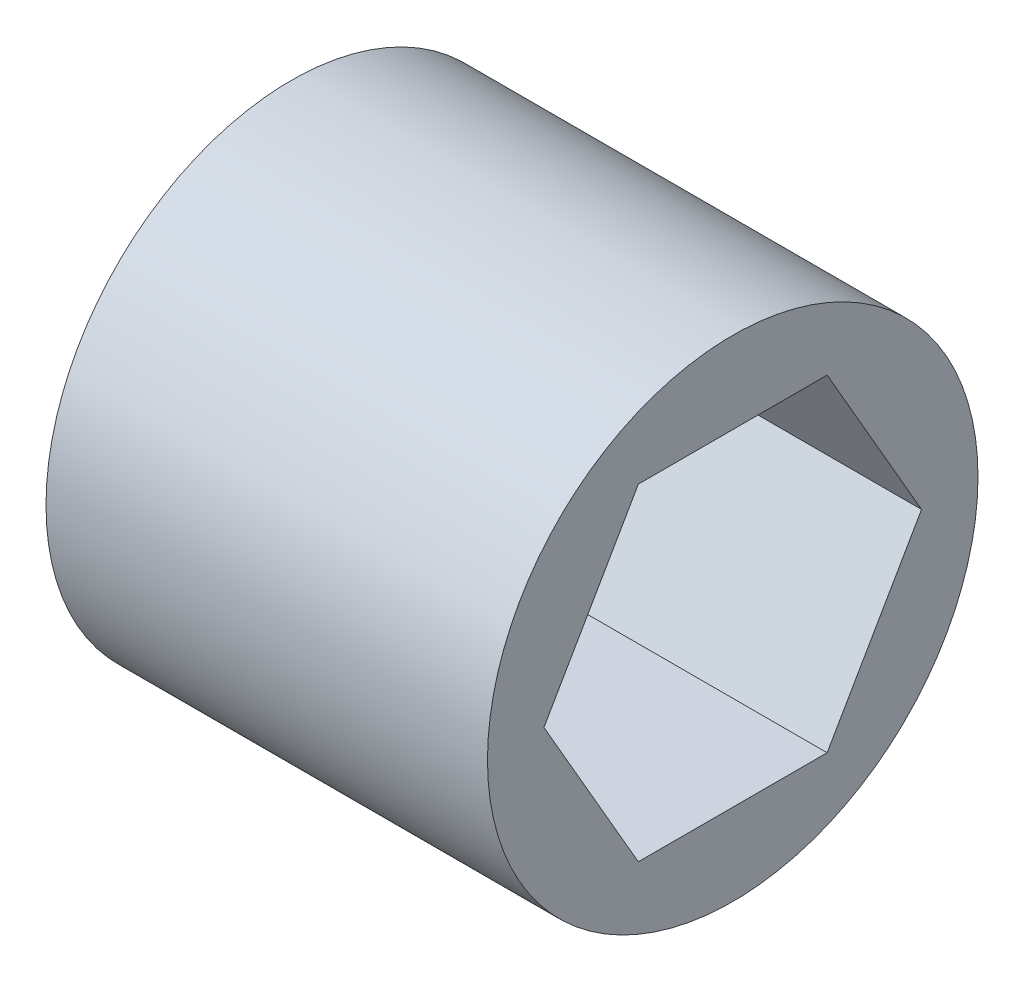
ISO-10303-21;
HEADER;
FILE_DESCRIPTION(('STEP AP214'),'2;1');
FILE_NAME('part.step','',(''),(''),'','','');
FILE_SCHEMA(('AUTOMOTIVE_DESIGN { 1 0 10303 214 1 1 1 1 }'));
ENDSEC;
DATA;
#1=APPLICATION_CONTEXT('core data for automotive mechanical design processes');
#2=APPLICATION_PROTOCOL_DEFINITION('international standard','automotive_design',2000,#1);
#3=PRODUCT_CONTEXT('',#1,'mechanical');
#4=PRODUCT('Part','Part','',(#3));
#5=PRODUCT_RELATED_PRODUCT_CATEGORY('part','',(#4));
#6=PRODUCT_DEFINITION_FORMATION('','',#4);
#7=PRODUCT_DEFINITION_CONTEXT('part definition',#1,'design');
#8=PRODUCT_DEFINITION('design','',#6,#7);
#9=PRODUCT_DEFINITION_SHAPE('','',#8);
#10=(LENGTH_UNIT() NAMED_UNIT(*) SI_UNIT(.MILLI.,.METRE.));
#11=(NAMED_UNIT(*) PLANE_ANGLE_UNIT() SI_UNIT($,.RADIAN.));
#12=(NAMED_UNIT(*) SI_UNIT($,.STERADIAN.) SOLID_ANGLE_UNIT());
#13=UNCERTAINTY_MEASURE_WITH_UNIT(LENGTH_MEASURE(1.E-05),#10,'distance_accuracy_value','');
#14=(GEOMETRIC_REPRESENTATION_CONTEXT(3) GLOBAL_UNCERTAINTY_ASSIGNED_CONTEXT((#13)) GLOBAL_UNIT_ASSIGNED_CONTEXT((#10,
#11,#12)) REPRESENTATION_CONTEXT('',''));
#15=CARTESIAN_POINT('',(0.,0.,0.));
#16=DIRECTION('',(0.,0.,1.));
#17=DIRECTION('',(1.,0.,0.));
#18=AXIS2_PLACEMENT_3D('',#15,#16,#17);
#19=CARTESIAN_POINT('',(17.145,0.,0.));
#20=DIRECTION('',(1.,0.,0.));
#21=DIRECTION('',(0.,0.,-1.));
#22=AXIS2_PLACEMENT_3D('',#19,#20,#21);
#23=PLANE('',#22);
#24=CARTESIAN_POINT('',(17.145,0.,0.));
#25=DIRECTION('',(1.,0.,0.));
#26=DIRECTION('',(0.,0.,-1.));
#27=AXIS2_PLACEMENT_3D('',#24,#25,#26);
#28=CIRCLE('',#27,9.525);
#29=CARTESIAN_POINT('',(17.145,0.,-9.525));
#30=VERTEX_POINT('',#29);
#31=EDGE_CURVE('E11',#30,#30,#28,.T.);
#32=ORIENTED_EDGE('',*,*,#31,.T.);
#33=EDGE_LOOP('',(#32));
#34=FACE_BOUND('',#33,.T.);
#35=DIRECTION('',(0.,0.866025403784438,0.5));
#36=VECTOR('',#35,1.);
#37=CARTESIAN_POINT('',(17.145,0.,-7.33234841870825));
#38=LINE('',#37,#36);
#39=CARTESIAN_POINT('',(17.145,0.,-7.33234841870825));
#40=VERTEX_POINT('',#39);
#41=CARTESIAN_POINT('',(17.145,6.35,-3.66617420935412));
#42=VERTEX_POINT('',#41);
#43=EDGE_CURVE('E100',#40,#42,#38,.T.);
#44=ORIENTED_EDGE('',*,*,#43,.F.);
#45=DIRECTION('',(0.,0.866025403784439,-0.5));
#46=VECTOR('',#45,1.);
#47=CARTESIAN_POINT('',(17.145,-6.35,-3.66617420935412));
#48=LINE('',#47,#46);
#49=CARTESIAN_POINT('',(17.145,-6.35,-3.66617420935412));
#50=VERTEX_POINT('',#49);
#51=EDGE_CURVE('E92',#50,#40,#48,.T.);
#52=ORIENTED_EDGE('',*,*,#51,.F.);
#53=DIRECTION('',(0.,0.,-1.));
#54=VECTOR('',#53,1.);
#55=CARTESIAN_POINT('',(17.145,-6.35,3.66617420935412));
#56=LINE('',#55,#54);
#57=CARTESIAN_POINT('',(17.145,-6.35,3.66617420935412));
#58=VERTEX_POINT('',#57);
#59=EDGE_CURVE('E120',#58,#50,#56,.T.);
#60=ORIENTED_EDGE('',*,*,#59,.F.);
#61=DIRECTION('',(0.,-0.866025403784438,-0.5));
#62=VECTOR('',#61,1.);
#63=CARTESIAN_POINT('',(17.145,0.,7.33234841870825));
#64=LINE('',#63,#62);
#65=CARTESIAN_POINT('',(17.145,0.,7.33234841870825));
#66=VERTEX_POINT('',#65);
#67=EDGE_CURVE('E118',#66,#58,#64,.T.);
#68=ORIENTED_EDGE('',*,*,#67,.F.);
#69=DIRECTION('',(0.,-0.866025403784439,0.5));
#70=VECTOR('',#69,1.);
#71=CARTESIAN_POINT('',(17.145,6.35,3.66617420935412));
#72=LINE('',#71,#70);
#73=CARTESIAN_POINT('',(17.145,6.35,3.66617420935412));
#74=VERTEX_POINT('',#73);
#75=EDGE_CURVE('E114',#74,#66,#72,.T.);
#76=ORIENTED_EDGE('',*,*,#75,.F.);
#77=DIRECTION('',(0.,0.,1.));
#78=VECTOR('',#77,1.);
#79=CARTESIAN_POINT('',(17.145,6.35,-3.66617420935412));
#80=LINE('',#79,#78);
#81=EDGE_CURVE('E112',#42,#74,#80,.T.);
#82=ORIENTED_EDGE('',*,*,#81,.F.);
#83=EDGE_LOOP('',(#44,#52,#60,#68,#76,#82));
#84=FACE_BOUND('',#83,.T.);
#85=ADVANCED_FACE('F39',(#34,#84),#23,.T.);
#86=CARTESIAN_POINT('',(0.,0.,0.));
#87=DIRECTION('',(1.,0.,0.));
#88=DIRECTION('',(0.,0.,-1.));
#89=AXIS2_PLACEMENT_3D('',#86,#87,#88);
#90=PLANE('',#89);
#91=CARTESIAN_POINT('',(0.,0.,0.));
#92=DIRECTION('',(1.,0.,0.));
#93=DIRECTION('',(0.,0.,-1.));
#94=AXIS2_PLACEMENT_3D('',#91,#92,#93);
#95=CIRCLE('',#94,9.525);
#96=CARTESIAN_POINT('',(0.,0.,-9.525));
#97=VERTEX_POINT('',#96);
#98=EDGE_CURVE('E43',#97,#97,#95,.T.);
#99=ORIENTED_EDGE('',*,*,#98,.F.);
#100=EDGE_LOOP('',(#99));
#101=FACE_BOUND('',#100,.T.);
#102=DIRECTION('',(0.,0.866025403784439,-0.5));
#103=VECTOR('',#102,1.);
#104=CARTESIAN_POINT('',(0.,-6.35,-3.66617420935412));
#105=LINE('',#104,#103);
#106=CARTESIAN_POINT('',(0.,-6.35,-3.66617420935412));
#107=VERTEX_POINT('',#106);
#108=CARTESIAN_POINT('',(0.,0.,-7.33234841870825));
#109=VERTEX_POINT('',#108);
#110=EDGE_CURVE('E62',#107,#109,#105,.T.);
#111=ORIENTED_EDGE('',*,*,#110,.T.);
#112=DIRECTION('',(0.,0.866025403784438,0.5));
#113=VECTOR('',#112,1.);
#114=CARTESIAN_POINT('',(0.,0.,-7.33234841870825));
#115=LINE('',#114,#113);
#116=CARTESIAN_POINT('',(0.,6.35,-3.66617420935412));
#117=VERTEX_POINT('',#116);
#118=EDGE_CURVE('E107',#109,#117,#115,.T.);
#119=ORIENTED_EDGE('',*,*,#118,.T.);
#120=DIRECTION('',(0.,0.,1.));
#121=VECTOR('',#120,1.);
#122=CARTESIAN_POINT('',(0.,6.35,-3.66617420935412));
#123=LINE('',#122,#121);
#124=CARTESIAN_POINT('',(0.,6.35,3.66617420935412));
#125=VERTEX_POINT('',#124);
#126=EDGE_CURVE('E124',#117,#125,#123,.T.);
#127=ORIENTED_EDGE('',*,*,#126,.T.);
#128=DIRECTION('',(0.,-0.866025403784439,0.5));
#129=VECTOR('',#128,1.);
#130=CARTESIAN_POINT('',(0.,6.35,3.66617420935412));
#131=LINE('',#130,#129);
#132=CARTESIAN_POINT('',(0.,0.,7.33234841870825));
#133=VERTEX_POINT('',#132);
#134=EDGE_CURVE('E127',#125,#133,#131,.T.);
#135=ORIENTED_EDGE('',*,*,#134,.T.);
#136=DIRECTION('',(0.,-0.866025403784438,-0.5));
#137=VECTOR('',#136,1.);
#138=CARTESIAN_POINT('',(0.,0.,7.33234841870825));
#139=LINE('',#138,#137);
#140=CARTESIAN_POINT('',(0.,-6.35,3.66617420935412));
#141=VERTEX_POINT('',#140);
#142=EDGE_CURVE('E130',#133,#141,#139,.T.);
#143=ORIENTED_EDGE('',*,*,#142,.T.);
#144=DIRECTION('',(0.,0.,-1.));
#145=VECTOR('',#144,1.);
#146=CARTESIAN_POINT('',(0.,-6.35,3.66617420935412));
#147=LINE('',#146,#145);
#148=EDGE_CURVE('E101',#141,#107,#147,.T.);
#149=ORIENTED_EDGE('',*,*,#148,.T.);
#150=EDGE_LOOP('',(#111,#119,#127,#135,#143,#149));
#151=FACE_BOUND('',#150,.T.);
#152=ADVANCED_FACE('F147',(#101,#151),#90,.F.);
#153=CARTESIAN_POINT('',(17.145,0.,0.));
#154=DIRECTION('',(-1.,0.,0.));
#155=DIRECTION('',(0.,0.,1.));
#156=AXIS2_PLACEMENT_3D('',#153,#154,#155);
#157=CYLINDRICAL_SURFACE('',#156,9.525);
#158=ORIENTED_EDGE('',*,*,#31,.F.);
#159=EDGE_LOOP('',(#158));
#160=FACE_BOUND('',#159,.T.);
#161=ORIENTED_EDGE('',*,*,#98,.T.);
#162=EDGE_LOOP('',(#161));
#163=FACE_BOUND('',#162,.T.);
#164=ADVANCED_FACE('F41',(#160,#163),#157,.T.);
#165=CARTESIAN_POINT('',(17.145,-6.35,-3.66617420935412));
#166=DIRECTION('',(0.,0.5,0.866025403784439));
#167=DIRECTION('',(0.,-0.866025403784439,0.5));
#168=AXIS2_PLACEMENT_3D('',#165,#166,#167);
#169=PLANE('',#168);
#170=ORIENTED_EDGE('',*,*,#110,.F.);
#171=DIRECTION('',(-1.,0.,0.));
#172=VECTOR('',#171,1.);
#173=CARTESIAN_POINT('',(17.145,-6.35,-3.66617420935412));
#174=LINE('',#173,#172);
#175=EDGE_CURVE('E96',#50,#107,#174,.T.);
#176=ORIENTED_EDGE('',*,*,#175,.F.);
#177=ORIENTED_EDGE('',*,*,#51,.T.);
#178=DIRECTION('',(-1.,0.,0.));
#179=VECTOR('',#178,1.);
#180=CARTESIAN_POINT('',(17.145,0.,-7.33234841870825));
#181=LINE('',#180,#179);
#182=EDGE_CURVE('E95',#40,#109,#181,.T.);
#183=ORIENTED_EDGE('',*,*,#182,.T.);
#184=EDGE_LOOP('',(#170,#176,#177,#183));
#185=FACE_BOUND('',#184,.T.);
#186=ADVANCED_FACE('F94',(#185),#169,.T.);
#187=CARTESIAN_POINT('',(17.145,0.,-7.33234841870825));
#188=DIRECTION('',(0.,-0.5,0.866025403784438));
#189=DIRECTION('',(0.,-0.866025403784438,-0.5));
#190=AXIS2_PLACEMENT_3D('',#187,#188,#189);
#191=PLANE('',#190);
#192=ORIENTED_EDGE('',*,*,#118,.F.);
#193=ORIENTED_EDGE('',*,*,#182,.F.);
#194=ORIENTED_EDGE('',*,*,#43,.T.);
#195=DIRECTION('',(-1.,0.,0.));
#196=VECTOR('',#195,1.);
#197=CARTESIAN_POINT('',(17.145,6.35,-3.66617420935412));
#198=LINE('',#197,#196);
#199=EDGE_CURVE('E108',#42,#117,#198,.T.);
#200=ORIENTED_EDGE('',*,*,#199,.T.);
#201=EDGE_LOOP('',(#192,#193,#194,#200));
#202=FACE_BOUND('',#201,.T.);
#203=ADVANCED_FACE('F104',(#202),#191,.T.);
#204=CARTESIAN_POINT('',(17.145,6.35,-3.66617420935412));
#205=DIRECTION('',(0.,-1.,0.));
#206=DIRECTION('',(0.,0.,-1.));
#207=AXIS2_PLACEMENT_3D('',#204,#205,#206);
#208=PLANE('',#207);
#209=ORIENTED_EDGE('',*,*,#126,.F.);
#210=ORIENTED_EDGE('',*,*,#199,.F.);
#211=ORIENTED_EDGE('',*,*,#81,.T.);
#212=DIRECTION('',(-1.,0.,0.));
#213=VECTOR('',#212,1.);
#214=CARTESIAN_POINT('',(17.145,6.35,3.66617420935412));
#215=LINE('',#214,#213);
#216=EDGE_CURVE('E139',#74,#125,#215,.T.);
#217=ORIENTED_EDGE('',*,*,#216,.T.);
#218=EDGE_LOOP('',(#209,#210,#211,#217));
#219=FACE_BOUND('',#218,.T.);
#220=ADVANCED_FACE('F143',(#219),#208,.T.);
#221=CARTESIAN_POINT('',(17.145,6.35,3.66617420935412));
#222=DIRECTION('',(0.,-0.5,-0.866025403784439));
#223=DIRECTION('',(0.,0.866025403784439,-0.5));
#224=AXIS2_PLACEMENT_3D('',#221,#222,#223);
#225=PLANE('',#224);
#226=ORIENTED_EDGE('',*,*,#134,.F.);
#227=ORIENTED_EDGE('',*,*,#216,.F.);
#228=ORIENTED_EDGE('',*,*,#75,.T.);
#229=DIRECTION('',(-1.,0.,0.));
#230=VECTOR('',#229,1.);
#231=CARTESIAN_POINT('',(17.145,0.,7.33234841870825));
#232=LINE('',#231,#230);
#233=EDGE_CURVE('E137',#66,#133,#232,.T.);
#234=ORIENTED_EDGE('',*,*,#233,.T.);
#235=EDGE_LOOP('',(#226,#227,#228,#234));
#236=FACE_BOUND('',#235,.T.);
#237=ADVANCED_FACE('F155',(#236),#225,.T.);
#238=CARTESIAN_POINT('',(17.145,0.,7.33234841870825));
#239=DIRECTION('',(0.,0.5,-0.866025403784438));
#240=DIRECTION('',(0.,0.866025403784439,0.5));
#241=AXIS2_PLACEMENT_3D('',#238,#239,#240);
#242=PLANE('',#241);
#243=ORIENTED_EDGE('',*,*,#142,.F.);
#244=ORIENTED_EDGE('',*,*,#233,.F.);
#245=ORIENTED_EDGE('',*,*,#67,.T.);
#246=DIRECTION('',(-1.,0.,0.));
#247=VECTOR('',#246,1.);
#248=CARTESIAN_POINT('',(17.145,-6.35,3.66617420935412));
#249=LINE('',#248,#247);
#250=EDGE_CURVE('E54',#58,#141,#249,.T.);
#251=ORIENTED_EDGE('',*,*,#250,.T.);
#252=EDGE_LOOP('',(#243,#244,#245,#251));
#253=FACE_BOUND('',#252,.T.);
#254=ADVANCED_FACE('F153',(#253),#242,.T.);
#255=CARTESIAN_POINT('',(17.145,-6.35,3.66617420935412));
#256=DIRECTION('',(0.,1.,0.));
#257=DIRECTION('',(0.,0.,1.));
#258=AXIS2_PLACEMENT_3D('',#255,#256,#257);
#259=PLANE('',#258);
#260=ORIENTED_EDGE('',*,*,#148,.F.);
#261=ORIENTED_EDGE('',*,*,#250,.F.);
#262=ORIENTED_EDGE('',*,*,#59,.T.);
#263=ORIENTED_EDGE('',*,*,#175,.T.);
#264=EDGE_LOOP('',(#260,#261,#262,#263));
#265=FACE_BOUND('',#264,.T.);
#266=ADVANCED_FACE('F149',(#265),#259,.T.);
#267=CLOSED_SHELL('',(#85,#152,#164,#186,#203,#220,#237,#254,#266));
#268=MANIFOLD_SOLID_BREP('B2',#267);
#269=ADVANCED_BREP_SHAPE_REPRESENTATION('',(#18,#268),#14);
#270=SHAPE_DEFINITION_REPRESENTATION(#9,#269);
ENDSEC;
END-ISO-10303-21;
